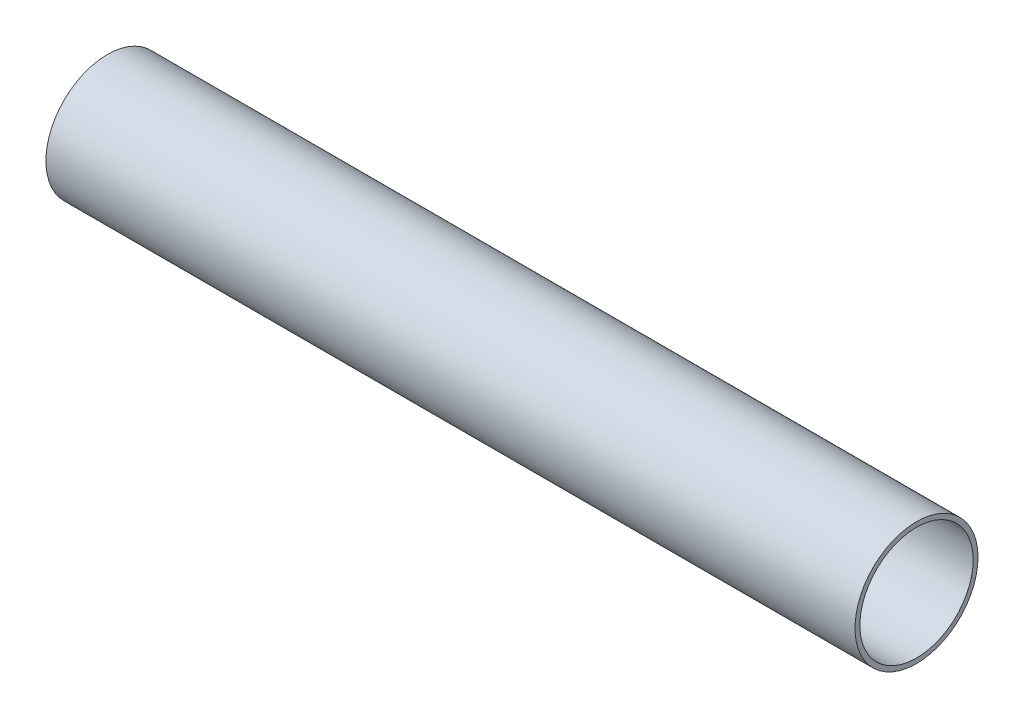
ISO-10303-21;
HEADER;
FILE_DESCRIPTION(('STEP AP214'),'2;1');
FILE_NAME('part.step','',(''),(''),'','','');
FILE_SCHEMA(('AUTOMOTIVE_DESIGN { 1 0 10303 214 1 1 1 1 }'));
ENDSEC;
DATA;
#1=APPLICATION_CONTEXT('core data for automotive mechanical design processes');
#2=APPLICATION_PROTOCOL_DEFINITION('international standard','automotive_design',2000,#1);
#3=PRODUCT_CONTEXT('',#1,'mechanical');
#4=PRODUCT('Part','Part','',(#3));
#5=PRODUCT_RELATED_PRODUCT_CATEGORY('part','',(#4));
#6=PRODUCT_DEFINITION_FORMATION('','',#4);
#7=PRODUCT_DEFINITION_CONTEXT('part definition',#1,'design');
#8=PRODUCT_DEFINITION('design','',#6,#7);
#9=PRODUCT_DEFINITION_SHAPE('','',#8);
#10=(LENGTH_UNIT() NAMED_UNIT(*) SI_UNIT(.MILLI.,.METRE.));
#11=(NAMED_UNIT(*) PLANE_ANGLE_UNIT() SI_UNIT($,.RADIAN.));
#12=(NAMED_UNIT(*) SI_UNIT($,.STERADIAN.) SOLID_ANGLE_UNIT());
#13=UNCERTAINTY_MEASURE_WITH_UNIT(LENGTH_MEASURE(1.E-05),#10,'distance_accuracy_value','');
#14=(GEOMETRIC_REPRESENTATION_CONTEXT(3) GLOBAL_UNCERTAINTY_ASSIGNED_CONTEXT((#13)) GLOBAL_UNIT_ASSIGNED_CONTEXT((#10,
#11,#12)) REPRESENTATION_CONTEXT('',''));
#15=CARTESIAN_POINT('',(0.,0.,0.));
#16=DIRECTION('',(0.,0.,1.));
#17=DIRECTION('',(1.,0.,0.));
#18=AXIS2_PLACEMENT_3D('',#15,#16,#17);
#19=CARTESIAN_POINT('',(750.,0.,0.));
#20=DIRECTION('',(1.,0.,0.));
#21=DIRECTION('',(0.,0.,-1.));
#22=AXIS2_PLACEMENT_3D('',#19,#20,#21);
#23=PLANE('',#22);
#24=CARTESIAN_POINT('',(750.,0.,0.));
#25=DIRECTION('',(1.,0.,0.));
#26=DIRECTION('',(0.,0.,-1.));
#27=AXIS2_PLACEMENT_3D('',#24,#25,#26);
#28=CIRCLE('',#27,57.);
#29=CARTESIAN_POINT('',(750.,0.,-57.));
#30=VERTEX_POINT('',#29);
#31=EDGE_CURVE('E10',#30,#30,#28,.T.);
#32=ORIENTED_EDGE('',*,*,#31,.T.);
#33=EDGE_LOOP('',(#32));
#34=FACE_BOUND('',#33,.T.);
#35=CARTESIAN_POINT('',(750.,0.,0.));
#36=DIRECTION('',(1.,0.,0.));
#37=DIRECTION('',(0.,0.,-1.));
#38=AXIS2_PLACEMENT_3D('',#35,#36,#37);
#39=CIRCLE('',#38,52.5);
#40=CARTESIAN_POINT('',(750.,0.,-52.5));
#41=VERTEX_POINT('',#40);
#42=EDGE_CURVE('E42',#41,#41,#39,.T.);
#43=ORIENTED_EDGE('',*,*,#42,.F.);
#44=EDGE_LOOP('',(#43));
#45=FACE_BOUND('',#44,.T.);
#46=ADVANCED_FACE('F31',(#34,#45),#23,.T.);
#47=CARTESIAN_POINT('',(0.,0.,0.));
#48=DIRECTION('',(1.,0.,0.));
#49=DIRECTION('',(0.,0.,-1.));
#50=AXIS2_PLACEMENT_3D('',#47,#48,#49);
#51=PLANE('',#50);
#52=CARTESIAN_POINT('',(0.,0.,0.));
#53=DIRECTION('',(1.,0.,0.));
#54=DIRECTION('',(0.,0.,-1.));
#55=AXIS2_PLACEMENT_3D('',#52,#53,#54);
#56=CIRCLE('',#55,57.);
#57=CARTESIAN_POINT('',(0.,0.,-57.));
#58=VERTEX_POINT('',#57);
#59=EDGE_CURVE('E35',#58,#58,#56,.T.);
#60=ORIENTED_EDGE('',*,*,#59,.F.);
#61=EDGE_LOOP('',(#60));
#62=FACE_BOUND('',#61,.T.);
#63=CARTESIAN_POINT('',(0.,0.,0.));
#64=DIRECTION('',(1.,0.,0.));
#65=DIRECTION('',(0.,0.,-1.));
#66=AXIS2_PLACEMENT_3D('',#63,#64,#65);
#67=CIRCLE('',#66,52.5);
#68=CARTESIAN_POINT('',(0.,0.,-52.5));
#69=VERTEX_POINT('',#68);
#70=EDGE_CURVE('E44',#69,#69,#67,.T.);
#71=ORIENTED_EDGE('',*,*,#70,.T.);
#72=EDGE_LOOP('',(#71));
#73=FACE_BOUND('',#72,.T.);
#74=ADVANCED_FACE('F54',(#62,#73),#51,.F.);
#75=CARTESIAN_POINT('',(750.,0.,0.));
#76=DIRECTION('',(-1.,0.,0.));
#77=DIRECTION('',(0.,0.,1.));
#78=AXIS2_PLACEMENT_3D('',#75,#76,#77);
#79=CYLINDRICAL_SURFACE('',#78,57.);
#80=ORIENTED_EDGE('',*,*,#31,.F.);
#81=EDGE_LOOP('',(#80));
#82=FACE_BOUND('',#81,.T.);
#83=ORIENTED_EDGE('',*,*,#59,.T.);
#84=EDGE_LOOP('',(#83));
#85=FACE_BOUND('',#84,.T.);
#86=ADVANCED_FACE('F33',(#82,#85),#79,.T.);
#87=CARTESIAN_POINT('',(750.,0.,0.));
#88=DIRECTION('',(-1.,0.,0.));
#89=DIRECTION('',(0.,0.,1.));
#90=AXIS2_PLACEMENT_3D('',#87,#88,#89);
#91=CYLINDRICAL_SURFACE('',#90,52.5);
#92=ORIENTED_EDGE('',*,*,#42,.T.);
#93=EDGE_LOOP('',(#92));
#94=FACE_BOUND('',#93,.T.);
#95=ORIENTED_EDGE('',*,*,#70,.F.);
#96=EDGE_LOOP('',(#95));
#97=FACE_BOUND('',#96,.T.);
#98=ADVANCED_FACE('F50',(#94,#97),#91,.F.);
#99=CLOSED_SHELL('',(#46,#74,#86,#98));
#100=MANIFOLD_SOLID_BREP('B2',#99);
#101=ADVANCED_BREP_SHAPE_REPRESENTATION('',(#18,#100),#14);
#102=SHAPE_DEFINITION_REPRESENTATION(#9,#101);
ENDSEC;
END-ISO-10303-21;
